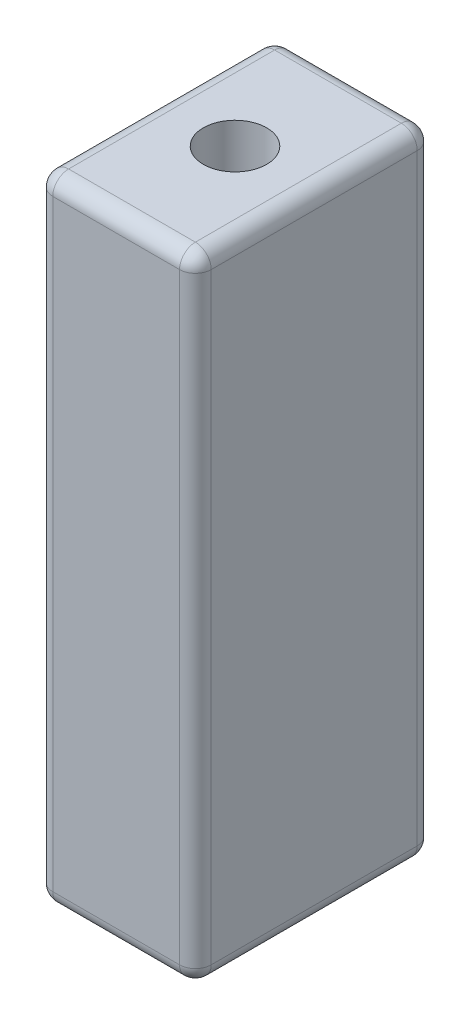
ISO-10303-21;
HEADER;
FILE_DESCRIPTION(('STEP AP214'),'2;1');
FILE_NAME('part.step','',(''),(''),'','','');
FILE_SCHEMA(('AUTOMOTIVE_DESIGN { 1 0 10303 214 1 1 1 1 }'));
ENDSEC;
DATA;
#1=APPLICATION_CONTEXT('core data for automotive mechanical design processes');
#2=APPLICATION_PROTOCOL_DEFINITION('international standard','automotive_design',2000,#1);
#3=PRODUCT_CONTEXT('',#1,'mechanical');
#4=PRODUCT('Part','Part','',(#3));
#5=PRODUCT_RELATED_PRODUCT_CATEGORY('part','',(#4));
#6=PRODUCT_DEFINITION_FORMATION('','',#4);
#7=PRODUCT_DEFINITION_CONTEXT('part definition',#1,'design');
#8=PRODUCT_DEFINITION('design','',#6,#7);
#9=PRODUCT_DEFINITION_SHAPE('','',#8);
#10=(LENGTH_UNIT() NAMED_UNIT(*) SI_UNIT(.MILLI.,.METRE.));
#11=(NAMED_UNIT(*) PLANE_ANGLE_UNIT() SI_UNIT($,.RADIAN.));
#12=(NAMED_UNIT(*) SI_UNIT($,.STERADIAN.) SOLID_ANGLE_UNIT());
#13=UNCERTAINTY_MEASURE_WITH_UNIT(LENGTH_MEASURE(1.E-05),#10,'distance_accuracy_value','');
#14=(GEOMETRIC_REPRESENTATION_CONTEXT(3) GLOBAL_UNCERTAINTY_ASSIGNED_CONTEXT((#13)) GLOBAL_UNIT_ASSIGNED_CONTEXT((#10,
#11,#12)) REPRESENTATION_CONTEXT('',''));
#15=CARTESIAN_POINT('',(0.,0.,0.));
#16=DIRECTION('',(0.,0.,1.));
#17=DIRECTION('',(1.,0.,0.));
#18=AXIS2_PLACEMENT_3D('',#15,#16,#17);
#19=CARTESIAN_POINT('',(20.,0.,30.));
#20=DIRECTION('',(0.,-1.,0.));
#21=DIRECTION('',(1.,0.,0.));
#22=AXIS2_PLACEMENT_3D('',#19,#20,#21);
#23=PLANE('',#22);
#24=CARTESIAN_POINT('',(9.99999999999999,0.,15.));
#25=DIRECTION('',(0.,-1.,0.));
#26=DIRECTION('',(1.,0.,0.));
#27=AXIS2_PLACEMENT_3D('',#24,#25,#26);
#28=CIRCLE('',#27,4.);
#29=CARTESIAN_POINT('',(14.,0.,15.));
#30=VERTEX_POINT('',#29);
#31=EDGE_CURVE('E702',#30,#30,#28,.T.);
#32=ORIENTED_EDGE('',*,*,#31,.F.);
#33=EDGE_LOOP('',(#32));
#34=FACE_BOUND('',#33,.T.);
#35=DIRECTION('',(0.,0.,-1.));
#36=VECTOR('',#35,1.);
#37=CARTESIAN_POINT('',(2.,0.,30.));
#38=LINE('',#37,#36);
#39=CARTESIAN_POINT('',(2.,0.,28.));
#40=VERTEX_POINT('',#39);
#41=CARTESIAN_POINT('',(2.,0.,2.));
#42=VERTEX_POINT('',#41);
#43=EDGE_CURVE('E189',#40,#42,#38,.T.);
#44=ORIENTED_EDGE('',*,*,#43,.T.);
#45=DIRECTION('',(-1.,0.,0.));
#46=VECTOR('',#45,1.);
#47=CARTESIAN_POINT('',(20.,0.,2.));
#48=LINE('',#47,#46);
#49=CARTESIAN_POINT('',(18.,0.,2.));
#50=VERTEX_POINT('',#49);
#51=EDGE_CURVE('E192',#42,#50,#48,.F.);
#52=ORIENTED_EDGE('',*,*,#51,.T.);
#53=DIRECTION('',(0.,0.,-1.));
#54=VECTOR('',#53,1.);
#55=CARTESIAN_POINT('',(18.,0.,30.));
#56=LINE('',#55,#54);
#57=CARTESIAN_POINT('',(18.,0.,28.));
#58=VERTEX_POINT('',#57);
#59=EDGE_CURVE('E183',#50,#58,#56,.F.);
#60=ORIENTED_EDGE('',*,*,#59,.T.);
#61=DIRECTION('',(-1.,0.,0.));
#62=VECTOR('',#61,1.);
#63=CARTESIAN_POINT('',(0.,0.,28.));
#64=LINE('',#63,#62);
#65=EDGE_CURVE('E186',#58,#40,#64,.T.);
#66=ORIENTED_EDGE('',*,*,#65,.T.);
#67=EDGE_LOOP('',(#44,#52,#60,#66));
#68=FACE_BOUND('',#67,.T.);
#69=ADVANCED_FACE('F42',(#34,#68),#23,.T.);
#70=CARTESIAN_POINT('',(20.,80.,30.));
#71=DIRECTION('',(1.,0.,0.));
#72=DIRECTION('',(0.,1.,0.));
#73=AXIS2_PLACEMENT_3D('',#70,#71,#72);
#74=PLANE('',#73);
#75=DIRECTION('',(0.,-1.,0.));
#76=VECTOR('',#75,1.);
#77=CARTESIAN_POINT('',(20.,0.,28.));
#78=LINE('',#77,#76);
#79=CARTESIAN_POINT('',(20.,78.,28.));
#80=VERTEX_POINT('',#79);
#81=CARTESIAN_POINT('',(20.,2.,28.));
#82=VERTEX_POINT('',#81);
#83=EDGE_CURVE('E209',#80,#82,#78,.T.);
#84=ORIENTED_EDGE('',*,*,#83,.T.);
#85=DIRECTION('',(0.,0.,-1.));
#86=VECTOR('',#85,1.);
#87=CARTESIAN_POINT('',(20.,2.,30.));
#88=LINE('',#87,#86);
#89=CARTESIAN_POINT('',(20.,2.,2.));
#90=VERTEX_POINT('',#89);
#91=EDGE_CURVE('E218',#82,#90,#88,.T.);
#92=ORIENTED_EDGE('',*,*,#91,.T.);
#93=DIRECTION('',(0.,-1.,0.));
#94=VECTOR('',#93,1.);
#95=CARTESIAN_POINT('',(20.,80.,2.));
#96=LINE('',#95,#94);
#97=CARTESIAN_POINT('',(20.,78.,2.));
#98=VERTEX_POINT('',#97);
#99=EDGE_CURVE('E215',#90,#98,#96,.F.);
#100=ORIENTED_EDGE('',*,*,#99,.T.);
#101=DIRECTION('',(0.,0.,-1.));
#102=VECTOR('',#101,1.);
#103=CARTESIAN_POINT('',(20.,78.,30.));
#104=LINE('',#103,#102);
#105=EDGE_CURVE('E212',#98,#80,#104,.F.);
#106=ORIENTED_EDGE('',*,*,#105,.T.);
#107=EDGE_LOOP('',(#84,#92,#100,#106));
#108=FACE_BOUND('',#107,.T.);
#109=ADVANCED_FACE('F354',(#108),#74,.T.);
#110=CARTESIAN_POINT('',(0.,80.,30.));
#111=DIRECTION('',(0.,1.,0.));
#112=DIRECTION('',(0.,0.,1.));
#113=AXIS2_PLACEMENT_3D('',#110,#111,#112);
#114=PLANE('',#113);
#115=CARTESIAN_POINT('',(10.,80.,15.));
#116=DIRECTION('',(0.,1.,0.));
#117=DIRECTION('',(0.,0.,1.));
#118=AXIS2_PLACEMENT_3D('',#115,#116,#117);
#119=CIRCLE('',#118,4.);
#120=CARTESIAN_POINT('',(10.,80.,19.));
#121=VERTEX_POINT('',#120);
#122=EDGE_CURVE('E688',#121,#121,#119,.T.);
#123=ORIENTED_EDGE('',*,*,#122,.F.);
#124=EDGE_LOOP('',(#123));
#125=FACE_BOUND('',#124,.T.);
#126=DIRECTION('',(1.,0.,0.));
#127=VECTOR('',#126,1.);
#128=CARTESIAN_POINT('',(20.,80.,28.));
#129=LINE('',#128,#127);
#130=CARTESIAN_POINT('',(2.,80.,28.));
#131=VERTEX_POINT('',#130);
#132=CARTESIAN_POINT('',(18.,80.,28.));
#133=VERTEX_POINT('',#132);
#134=EDGE_CURVE('E222',#131,#133,#129,.T.);
#135=ORIENTED_EDGE('',*,*,#134,.T.);
#136=DIRECTION('',(0.,0.,-1.));
#137=VECTOR('',#136,1.);
#138=CARTESIAN_POINT('',(18.,80.,30.));
#139=LINE('',#138,#137);
#140=CARTESIAN_POINT('',(18.,80.,2.));
#141=VERTEX_POINT('',#140);
#142=EDGE_CURVE('E11',#133,#141,#139,.T.);
#143=ORIENTED_EDGE('',*,*,#142,.T.);
#144=DIRECTION('',(1.,0.,0.));
#145=VECTOR('',#144,1.);
#146=CARTESIAN_POINT('',(0.,80.,2.));
#147=LINE('',#146,#145);
#148=CARTESIAN_POINT('',(2.,80.,2.));
#149=VERTEX_POINT('',#148);
#150=EDGE_CURVE('E52',#141,#149,#147,.F.);
#151=ORIENTED_EDGE('',*,*,#150,.T.);
#152=DIRECTION('',(0.,0.,-1.));
#153=VECTOR('',#152,1.);
#154=CARTESIAN_POINT('',(2.,80.,30.));
#155=LINE('',#154,#153);
#156=EDGE_CURVE('E225',#149,#131,#155,.F.);
#157=ORIENTED_EDGE('',*,*,#156,.T.);
#158=EDGE_LOOP('',(#135,#143,#151,#157));
#159=FACE_BOUND('',#158,.T.);
#160=ADVANCED_FACE('F383',(#125,#159),#114,.T.);
#161=CARTESIAN_POINT('',(0.,0.,30.));
#162=DIRECTION('',(-1.,0.,0.));
#163=DIRECTION('',(0.,0.,1.));
#164=AXIS2_PLACEMENT_3D('',#161,#162,#163);
#165=PLANE('',#164);
#166=DIRECTION('',(0.,0.,-1.));
#167=VECTOR('',#166,1.);
#168=CARTESIAN_POINT('',(0.,78.,30.));
#169=LINE('',#168,#167);
#170=CARTESIAN_POINT('',(0.,78.,28.));
#171=VERTEX_POINT('',#170);
#172=CARTESIAN_POINT('',(0.,78.,2.));
#173=VERTEX_POINT('',#172);
#174=EDGE_CURVE('E171',#171,#173,#169,.T.);
#175=ORIENTED_EDGE('',*,*,#174,.T.);
#176=DIRECTION('',(0.,1.,0.));
#177=VECTOR('',#176,1.);
#178=CARTESIAN_POINT('',(0.,0.,2.));
#179=LINE('',#178,#177);
#180=CARTESIAN_POINT('',(0.,2.,2.));
#181=VERTEX_POINT('',#180);
#182=EDGE_CURVE('E139',#173,#181,#179,.F.);
#183=ORIENTED_EDGE('',*,*,#182,.T.);
#184=DIRECTION('',(0.,0.,-1.));
#185=VECTOR('',#184,1.);
#186=CARTESIAN_POINT('',(0.,2.,30.));
#187=LINE('',#186,#185);
#188=CARTESIAN_POINT('',(0.,2.,28.));
#189=VERTEX_POINT('',#188);
#190=EDGE_CURVE('E178',#181,#189,#187,.F.);
#191=ORIENTED_EDGE('',*,*,#190,.T.);
#192=DIRECTION('',(0.,1.,0.));
#193=VECTOR('',#192,1.);
#194=CARTESIAN_POINT('',(0.,80.,28.));
#195=LINE('',#194,#193);
#196=EDGE_CURVE('E167',#189,#171,#195,.T.);
#197=ORIENTED_EDGE('',*,*,#196,.T.);
#198=EDGE_LOOP('',(#175,#183,#191,#197));
#199=FACE_BOUND('',#198,.T.);
#200=ADVANCED_FACE('F388',(#199),#165,.T.);
#201=CARTESIAN_POINT('',(0.,0.,30.));
#202=DIRECTION('',(0.,0.,-1.));
#203=DIRECTION('',(-1.,0.,0.));
#204=AXIS2_PLACEMENT_3D('',#201,#202,#203);
#205=PLANE('',#204);
#206=DIRECTION('',(0.,1.,0.));
#207=VECTOR('',#206,1.);
#208=CARTESIAN_POINT('',(2.,0.,30.));
#209=LINE('',#208,#207);
#210=CARTESIAN_POINT('',(2.,78.,30.));
#211=VERTEX_POINT('',#210);
#212=CARTESIAN_POINT('',(2.,2.,30.));
#213=VERTEX_POINT('',#212);
#214=EDGE_CURVE('E202',#211,#213,#209,.F.);
#215=ORIENTED_EDGE('',*,*,#214,.T.);
#216=DIRECTION('',(-1.,0.,0.));
#217=VECTOR('',#216,1.);
#218=CARTESIAN_POINT('',(20.,2.,30.));
#219=LINE('',#218,#217);
#220=CARTESIAN_POINT('',(18.,2.,30.));
#221=VERTEX_POINT('',#220);
#222=EDGE_CURVE('E205',#213,#221,#219,.F.);
#223=ORIENTED_EDGE('',*,*,#222,.T.);
#224=DIRECTION('',(0.,-1.,0.));
#225=VECTOR('',#224,1.);
#226=CARTESIAN_POINT('',(18.,80.,30.));
#227=LINE('',#226,#225);
#228=CARTESIAN_POINT('',(18.,78.,30.));
#229=VERTEX_POINT('',#228);
#230=EDGE_CURVE('E199',#221,#229,#227,.F.);
#231=ORIENTED_EDGE('',*,*,#230,.T.);
#232=DIRECTION('',(1.,0.,0.));
#233=VECTOR('',#232,1.);
#234=CARTESIAN_POINT('',(0.,78.,30.));
#235=LINE('',#234,#233);
#236=EDGE_CURVE('E196',#229,#211,#235,.F.);
#237=ORIENTED_EDGE('',*,*,#236,.T.);
#238=EDGE_LOOP('',(#215,#223,#231,#237));
#239=FACE_BOUND('',#238,.T.);
#240=ADVANCED_FACE('F320',(#239),#205,.F.);
#241=CARTESIAN_POINT('',(0.,0.,0.));
#242=DIRECTION('',(0.,0.,-1.));
#243=DIRECTION('',(-1.,0.,0.));
#244=AXIS2_PLACEMENT_3D('',#241,#242,#243);
#245=PLANE('',#244);
#246=DIRECTION('',(-1.,0.,0.));
#247=VECTOR('',#246,1.);
#248=CARTESIAN_POINT('',(0.,2.,0.));
#249=LINE('',#248,#247);
#250=CARTESIAN_POINT('',(18.,2.,0.));
#251=VERTEX_POINT('',#250);
#252=CARTESIAN_POINT('',(2.,2.,0.));
#253=VERTEX_POINT('',#252);
#254=EDGE_CURVE('E164',#251,#253,#249,.T.);
#255=ORIENTED_EDGE('',*,*,#254,.T.);
#256=DIRECTION('',(0.,1.,0.));
#257=VECTOR('',#256,1.);
#258=CARTESIAN_POINT('',(2.,0.,0.));
#259=LINE('',#258,#257);
#260=CARTESIAN_POINT('',(2.,78.,0.));
#261=VERTEX_POINT('',#260);
#262=EDGE_CURVE('E137',#253,#261,#259,.T.);
#263=ORIENTED_EDGE('',*,*,#262,.T.);
#264=DIRECTION('',(1.,0.,0.));
#265=VECTOR('',#264,1.);
#266=CARTESIAN_POINT('',(0.,78.,0.));
#267=LINE('',#266,#265);
#268=CARTESIAN_POINT('',(18.,78.,0.));
#269=VERTEX_POINT('',#268);
#270=EDGE_CURVE('E154',#261,#269,#267,.T.);
#271=ORIENTED_EDGE('',*,*,#270,.T.);
#272=DIRECTION('',(0.,-1.,0.));
#273=VECTOR('',#272,1.);
#274=CARTESIAN_POINT('',(18.,0.,0.));
#275=LINE('',#274,#273);
#276=EDGE_CURVE('E160',#269,#251,#275,.T.);
#277=ORIENTED_EDGE('',*,*,#276,.T.);
#278=EDGE_LOOP('',(#255,#263,#271,#277));
#279=FACE_BOUND('',#278,.T.);
#280=ADVANCED_FACE('F162',(#279),#245,.T.);
#281=CARTESIAN_POINT('',(18.,80.,28.));
#282=DIRECTION('',(0.,1.,0.));
#283=DIRECTION('',(-1.,0.,0.));
#284=AXIS2_PLACEMENT_3D('',#281,#282,#283);
#285=CYLINDRICAL_SURFACE('',#284,2.);
#286=CARTESIAN_POINT('',(18.,2.,28.));
#287=DIRECTION('',(0.,-1.,0.));
#288=DIRECTION('',(0.,0.,-1.));
#289=AXIS2_PLACEMENT_3D('',#286,#287,#288);
#290=CIRCLE('',#289,2.);
#291=EDGE_CURVE('E46',#82,#221,#290,.T.);
#292=ORIENTED_EDGE('',*,*,#291,.F.);
#293=ORIENTED_EDGE('',*,*,#83,.F.);
#294=CARTESIAN_POINT('',(18.,78.,28.));
#295=DIRECTION('',(0.,1.,0.));
#296=DIRECTION('',(0.,0.,1.));
#297=AXIS2_PLACEMENT_3D('',#294,#295,#296);
#298=CIRCLE('',#297,2.);
#299=EDGE_CURVE('E299',#229,#80,#298,.T.);
#300=ORIENTED_EDGE('',*,*,#299,.F.);
#301=ORIENTED_EDGE('',*,*,#230,.F.);
#302=EDGE_LOOP('',(#292,#293,#300,#301));
#303=FACE_BOUND('',#302,.T.);
#304=ADVANCED_FACE('F44',(#303),#285,.T.);
#305=CARTESIAN_POINT('',(18.,2.,28.));
#306=DIRECTION('',(0.,0.,1.));
#307=DIRECTION('',(1.,0.,0.));
#308=AXIS2_PLACEMENT_3D('',#305,#306,#307);
#309=SPHERICAL_SURFACE('',#308,2.);
#310=CARTESIAN_POINT('',(18.,2.,28.));
#311=DIRECTION('',(0.,0.,1.));
#312=DIRECTION('',(1.,0.,0.));
#313=AXIS2_PLACEMENT_3D('',#310,#311,#312);
#314=CIRCLE('',#313,2.);
#315=EDGE_CURVE('E293',#82,#58,#314,.F.);
#316=ORIENTED_EDGE('',*,*,#315,.F.);
#317=ORIENTED_EDGE('',*,*,#291,.T.);
#318=CARTESIAN_POINT('',(18.,2.,28.));
#319=DIRECTION('',(1.,0.,0.));
#320=DIRECTION('',(0.,0.,-1.));
#321=AXIS2_PLACEMENT_3D('',#318,#319,#320);
#322=CIRCLE('',#321,2.);
#323=EDGE_CURVE('E297',#58,#221,#322,.F.);
#324=ORIENTED_EDGE('',*,*,#323,.F.);
#325=EDGE_LOOP('',(#316,#317,#324));
#326=FACE_BOUND('',#325,.T.);
#327=ADVANCED_FACE('F313',(#326),#309,.T.);
#328=CARTESIAN_POINT('',(18.,78.,28.));
#329=DIRECTION('',(1.,0.,0.));
#330=DIRECTION('',(0.,0.,-1.));
#331=AXIS2_PLACEMENT_3D('',#328,#329,#330);
#332=SPHERICAL_SURFACE('',#331,2.);
#333=CARTESIAN_POINT('',(18.,78.,28.));
#334=DIRECTION('',(1.,0.,0.));
#335=DIRECTION('',(0.,0.,-1.));
#336=AXIS2_PLACEMENT_3D('',#333,#334,#335);
#337=CIRCLE('',#336,2.);
#338=EDGE_CURVE('E285',#229,#133,#337,.F.);
#339=ORIENTED_EDGE('',*,*,#338,.F.);
#340=ORIENTED_EDGE('',*,*,#299,.T.);
#341=CARTESIAN_POINT('',(18.,78.,28.));
#342=DIRECTION('',(0.,0.,1.));
#343=DIRECTION('',(1.,0.,0.));
#344=AXIS2_PLACEMENT_3D('',#341,#342,#343);
#345=CIRCLE('',#344,2.);
#346=EDGE_CURVE('E289',#133,#80,#345,.F.);
#347=ORIENTED_EDGE('',*,*,#346,.F.);
#348=EDGE_LOOP('',(#339,#340,#347));
#349=FACE_BOUND('',#348,.T.);
#350=ADVANCED_FACE('F594',(#349),#332,.T.);
#351=CARTESIAN_POINT('',(20.,2.,28.));
#352=DIRECTION('',(1.,0.,0.));
#353=DIRECTION('',(0.,1.,0.));
#354=AXIS2_PLACEMENT_3D('',#351,#352,#353);
#355=CYLINDRICAL_SURFACE('',#354,2.);
#356=ORIENTED_EDGE('',*,*,#323,.T.);
#357=ORIENTED_EDGE('',*,*,#222,.F.);
#358=CARTESIAN_POINT('',(2.,2.,28.));
#359=DIRECTION('',(-1.,0.,0.));
#360=DIRECTION('',(0.,0.,1.));
#361=AXIS2_PLACEMENT_3D('',#358,#359,#360);
#362=CIRCLE('',#361,2.);
#363=EDGE_CURVE('E277',#40,#213,#362,.T.);
#364=ORIENTED_EDGE('',*,*,#363,.F.);
#365=ORIENTED_EDGE('',*,*,#65,.F.);
#366=EDGE_LOOP('',(#356,#357,#364,#365));
#367=FACE_BOUND('',#366,.T.);
#368=ADVANCED_FACE('F325',(#367),#355,.T.);
#369=CARTESIAN_POINT('',(18.,2.,30.));
#370=DIRECTION('',(0.,0.,-1.));
#371=DIRECTION('',(-1.,0.,0.));
#372=AXIS2_PLACEMENT_3D('',#369,#370,#371);
#373=CYLINDRICAL_SURFACE('',#372,2.);
#374=ORIENTED_EDGE('',*,*,#315,.T.);
#375=ORIENTED_EDGE('',*,*,#59,.F.);
#376=CARTESIAN_POINT('',(18.,2.,2.));
#377=DIRECTION('',(0.,0.,-1.));
#378=DIRECTION('',(-1.,0.,0.));
#379=AXIS2_PLACEMENT_3D('',#376,#377,#378);
#380=CIRCLE('',#379,2.);
#381=EDGE_CURVE('E273',#90,#50,#380,.T.);
#382=ORIENTED_EDGE('',*,*,#381,.F.);
#383=ORIENTED_EDGE('',*,*,#91,.F.);
#384=EDGE_LOOP('',(#374,#375,#382,#383));
#385=FACE_BOUND('',#384,.T.);
#386=ADVANCED_FACE('F352',(#385),#373,.T.);
#387=CARTESIAN_POINT('',(18.,0.,2.));
#388=DIRECTION('',(0.,-1.,0.));
#389=DIRECTION('',(1.,0.,0.));
#390=AXIS2_PLACEMENT_3D('',#387,#388,#389);
#391=CYLINDRICAL_SURFACE('',#390,2.);
#392=CARTESIAN_POINT('',(18.,78.,2.));
#393=DIRECTION('',(0.,1.,0.));
#394=DIRECTION('',(0.,0.,1.));
#395=AXIS2_PLACEMENT_3D('',#392,#393,#394);
#396=CIRCLE('',#395,2.);
#397=EDGE_CURVE('E266',#98,#269,#396,.T.);
#398=ORIENTED_EDGE('',*,*,#397,.F.);
#399=ORIENTED_EDGE('',*,*,#99,.F.);
#400=CARTESIAN_POINT('',(18.,2.,2.));
#401=DIRECTION('',(0.,-1.,0.));
#402=DIRECTION('',(1.,0.,0.));
#403=AXIS2_PLACEMENT_3D('',#400,#401,#402);
#404=CIRCLE('',#403,2.);
#405=EDGE_CURVE('E270',#251,#90,#404,.T.);
#406=ORIENTED_EDGE('',*,*,#405,.F.);
#407=ORIENTED_EDGE('',*,*,#276,.F.);
#408=EDGE_LOOP('',(#398,#399,#406,#407));
#409=FACE_BOUND('',#408,.T.);
#410=ADVANCED_FACE('F362',(#409),#391,.T.);
#411=CARTESIAN_POINT('',(18.,78.,30.));
#412=DIRECTION('',(0.,0.,-1.));
#413=DIRECTION('',(-1.,0.,0.));
#414=AXIS2_PLACEMENT_3D('',#411,#412,#413);
#415=CYLINDRICAL_SURFACE('',#414,2.);
#416=ORIENTED_EDGE('',*,*,#346,.T.);
#417=ORIENTED_EDGE('',*,*,#105,.F.);
#418=CARTESIAN_POINT('',(18.,78.,2.));
#419=DIRECTION('',(0.,0.,-1.));
#420=DIRECTION('',(-1.,0.,0.));
#421=AXIS2_PLACEMENT_3D('',#418,#419,#420);
#422=CIRCLE('',#421,2.);
#423=EDGE_CURVE('E262',#141,#98,#422,.T.);
#424=ORIENTED_EDGE('',*,*,#423,.F.);
#425=ORIENTED_EDGE('',*,*,#142,.F.);
#426=EDGE_LOOP('',(#416,#417,#424,#425));
#427=FACE_BOUND('',#426,.T.);
#428=ADVANCED_FACE('F359',(#427),#415,.T.);
#429=CARTESIAN_POINT('',(0.,78.,28.));
#430=DIRECTION('',(-1.,0.,0.));
#431=DIRECTION('',(0.,0.,1.));
#432=AXIS2_PLACEMENT_3D('',#429,#430,#431);
#433=CYLINDRICAL_SURFACE('',#432,2.);
#434=ORIENTED_EDGE('',*,*,#338,.T.);
#435=ORIENTED_EDGE('',*,*,#134,.F.);
#436=CARTESIAN_POINT('',(2.,78.,28.));
#437=DIRECTION('',(-1.,0.,0.));
#438=DIRECTION('',(0.,0.,1.));
#439=AXIS2_PLACEMENT_3D('',#436,#437,#438);
#440=CIRCLE('',#439,2.);
#441=EDGE_CURVE('E258',#211,#131,#440,.T.);
#442=ORIENTED_EDGE('',*,*,#441,.F.);
#443=ORIENTED_EDGE('',*,*,#236,.F.);
#444=EDGE_LOOP('',(#434,#435,#442,#443));
#445=FACE_BOUND('',#444,.T.);
#446=ADVANCED_FACE('F547',(#445),#433,.T.);
#447=CARTESIAN_POINT('',(2.,0.,28.));
#448=DIRECTION('',(0.,-1.,0.));
#449=DIRECTION('',(0.,0.,-1.));
#450=AXIS2_PLACEMENT_3D('',#447,#448,#449);
#451=CYLINDRICAL_SURFACE('',#450,2.);
#452=CARTESIAN_POINT('',(2.,2.,28.));
#453=DIRECTION('',(0.,-1.,0.));
#454=DIRECTION('',(0.,0.,-1.));
#455=AXIS2_PLACEMENT_3D('',#452,#453,#454);
#456=CIRCLE('',#455,2.);
#457=EDGE_CURVE('E281',#213,#189,#456,.T.);
#458=ORIENTED_EDGE('',*,*,#457,.F.);
#459=ORIENTED_EDGE('',*,*,#214,.F.);
#460=CARTESIAN_POINT('',(2.,78.,28.));
#461=DIRECTION('',(0.,1.,0.));
#462=DIRECTION('',(0.,0.,1.));
#463=AXIS2_PLACEMENT_3D('',#460,#461,#462);
#464=CIRCLE('',#463,2.);
#465=EDGE_CURVE('E254',#171,#211,#464,.T.);
#466=ORIENTED_EDGE('',*,*,#465,.F.);
#467=ORIENTED_EDGE('',*,*,#196,.F.);
#468=EDGE_LOOP('',(#458,#459,#466,#467));
#469=FACE_BOUND('',#468,.T.);
#470=ADVANCED_FACE('F329',(#469),#451,.T.);
#471=CARTESIAN_POINT('',(2.,2.,28.));
#472=DIRECTION('',(0.,0.,1.));
#473=DIRECTION('',(1.,0.,0.));
#474=AXIS2_PLACEMENT_3D('',#471,#472,#473);
#475=SPHERICAL_SURFACE('',#474,2.);
#476=ORIENTED_EDGE('',*,*,#363,.T.);
#477=ORIENTED_EDGE('',*,*,#457,.T.);
#478=CARTESIAN_POINT('',(2.,2.,28.));
#479=DIRECTION('',(0.,0.,1.));
#480=DIRECTION('',(1.,0.,0.));
#481=AXIS2_PLACEMENT_3D('',#478,#479,#480);
#482=CIRCLE('',#481,2.);
#483=EDGE_CURVE('E250',#40,#189,#482,.F.);
#484=ORIENTED_EDGE('',*,*,#483,.F.);
#485=EDGE_LOOP('',(#476,#477,#484));
#486=FACE_BOUND('',#485,.T.);
#487=ADVANCED_FACE('F333',(#486),#475,.T.);
#488=CARTESIAN_POINT('',(18.,2.,2.));
#489=DIRECTION('',(1.,0.,0.));
#490=DIRECTION('',(0.,1.,0.));
#491=AXIS2_PLACEMENT_3D('',#488,#489,#490);
#492=SPHERICAL_SURFACE('',#491,2.);
#493=ORIENTED_EDGE('',*,*,#405,.T.);
#494=ORIENTED_EDGE('',*,*,#381,.T.);
#495=CARTESIAN_POINT('',(18.,2.,2.));
#496=DIRECTION('',(1.,0.,0.));
#497=DIRECTION('',(0.,0.,-1.));
#498=AXIS2_PLACEMENT_3D('',#495,#496,#497);
#499=CIRCLE('',#498,2.);
#500=EDGE_CURVE('E247',#251,#50,#499,.F.);
#501=ORIENTED_EDGE('',*,*,#500,.F.);
#502=EDGE_LOOP('',(#493,#494,#501));
#503=FACE_BOUND('',#502,.T.);
#504=ADVANCED_FACE('F348',(#503),#492,.T.);
#505=CARTESIAN_POINT('',(18.,78.,2.));
#506=DIRECTION('',(1.,0.,0.));
#507=DIRECTION('',(0.,0.,-1.));
#508=AXIS2_PLACEMENT_3D('',#505,#506,#507);
#509=SPHERICAL_SURFACE('',#508,2.);
#510=ORIENTED_EDGE('',*,*,#423,.T.);
#511=ORIENTED_EDGE('',*,*,#397,.T.);
#512=CARTESIAN_POINT('',(18.,78.,2.));
#513=DIRECTION('',(1.,0.,0.));
#514=DIRECTION('',(0.,0.,-1.));
#515=AXIS2_PLACEMENT_3D('',#512,#513,#514);
#516=CIRCLE('',#515,2.);
#517=EDGE_CURVE('E156',#141,#269,#516,.F.);
#518=ORIENTED_EDGE('',*,*,#517,.F.);
#519=EDGE_LOOP('',(#510,#511,#518));
#520=FACE_BOUND('',#519,.T.);
#521=ADVANCED_FACE('F364',(#520),#509,.T.);
#522=CARTESIAN_POINT('',(2.,78.,28.));
#523=DIRECTION('',(0.,0.,1.));
#524=DIRECTION('',(1.,0.,0.));
#525=AXIS2_PLACEMENT_3D('',#522,#523,#524);
#526=SPHERICAL_SURFACE('',#525,2.);
#527=ORIENTED_EDGE('',*,*,#465,.T.);
#528=ORIENTED_EDGE('',*,*,#441,.T.);
#529=CARTESIAN_POINT('',(2.,78.,28.));
#530=DIRECTION('',(0.,0.,1.));
#531=DIRECTION('',(1.,0.,0.));
#532=AXIS2_PLACEMENT_3D('',#529,#530,#531);
#533=CIRCLE('',#532,2.);
#534=EDGE_CURVE('E241',#171,#131,#533,.F.);
#535=ORIENTED_EDGE('',*,*,#534,.F.);
#536=EDGE_LOOP('',(#527,#528,#535));
#537=FACE_BOUND('',#536,.T.);
#538=ADVANCED_FACE('F366',(#537),#526,.T.);
#539=CARTESIAN_POINT('',(2.,2.,30.));
#540=DIRECTION('',(0.,0.,-1.));
#541=DIRECTION('',(-1.,0.,0.));
#542=AXIS2_PLACEMENT_3D('',#539,#540,#541);
#543=CYLINDRICAL_SURFACE('',#542,2.);
#544=ORIENTED_EDGE('',*,*,#483,.T.);
#545=ORIENTED_EDGE('',*,*,#190,.F.);
#546=CARTESIAN_POINT('',(2.,2.,2.));
#547=DIRECTION('',(0.,0.,-1.));
#548=DIRECTION('',(-1.,0.,0.));
#549=AXIS2_PLACEMENT_3D('',#546,#547,#548);
#550=CIRCLE('',#549,2.);
#551=EDGE_CURVE('E237',#42,#181,#550,.T.);
#552=ORIENTED_EDGE('',*,*,#551,.F.);
#553=ORIENTED_EDGE('',*,*,#43,.F.);
#554=EDGE_LOOP('',(#544,#545,#552,#553));
#555=FACE_BOUND('',#554,.T.);
#556=ADVANCED_FACE('F338',(#555),#543,.T.);
#557=CARTESIAN_POINT('',(0.,2.,2.));
#558=DIRECTION('',(-1.,0.,0.));
#559=DIRECTION('',(0.,-1.,0.));
#560=AXIS2_PLACEMENT_3D('',#557,#558,#559);
#561=CYLINDRICAL_SURFACE('',#560,2.);
#562=ORIENTED_EDGE('',*,*,#500,.T.);
#563=ORIENTED_EDGE('',*,*,#51,.F.);
#564=CARTESIAN_POINT('',(2.,2.,2.));
#565=DIRECTION('',(-1.,0.,0.));
#566=DIRECTION('',(0.,-1.,0.));
#567=AXIS2_PLACEMENT_3D('',#564,#565,#566);
#568=CIRCLE('',#567,2.);
#569=EDGE_CURVE('E152',#253,#42,#568,.T.);
#570=ORIENTED_EDGE('',*,*,#569,.F.);
#571=ORIENTED_EDGE('',*,*,#254,.F.);
#572=EDGE_LOOP('',(#562,#563,#570,#571));
#573=FACE_BOUND('',#572,.T.);
#574=ADVANCED_FACE('F342',(#573),#561,.T.);
#575=CARTESIAN_POINT('',(0.,78.,2.));
#576=DIRECTION('',(1.,0.,0.));
#577=DIRECTION('',(0.,0.,-1.));
#578=AXIS2_PLACEMENT_3D('',#575,#576,#577);
#579=CYLINDRICAL_SURFACE('',#578,2.);
#580=ORIENTED_EDGE('',*,*,#517,.T.);
#581=ORIENTED_EDGE('',*,*,#270,.F.);
#582=CARTESIAN_POINT('',(2.,78.,2.));
#583=DIRECTION('',(-1.,0.,0.));
#584=DIRECTION('',(0.,0.,1.));
#585=AXIS2_PLACEMENT_3D('',#582,#583,#584);
#586=CIRCLE('',#585,2.);
#587=EDGE_CURVE('E146',#149,#261,#586,.T.);
#588=ORIENTED_EDGE('',*,*,#587,.F.);
#589=ORIENTED_EDGE('',*,*,#150,.F.);
#590=EDGE_LOOP('',(#580,#581,#588,#589));
#591=FACE_BOUND('',#590,.T.);
#592=ADVANCED_FACE('F155',(#591),#579,.T.);
#593=CARTESIAN_POINT('',(2.,78.,30.));
#594=DIRECTION('',(0.,0.,-1.));
#595=DIRECTION('',(-1.,0.,0.));
#596=AXIS2_PLACEMENT_3D('',#593,#594,#595);
#597=CYLINDRICAL_SURFACE('',#596,2.);
#598=ORIENTED_EDGE('',*,*,#534,.T.);
#599=ORIENTED_EDGE('',*,*,#156,.F.);
#600=CARTESIAN_POINT('',(2.,78.,2.));
#601=DIRECTION('',(0.,0.,-1.));
#602=DIRECTION('',(-1.,0.,0.));
#603=AXIS2_PLACEMENT_3D('',#600,#601,#602);
#604=CIRCLE('',#603,2.);
#605=EDGE_CURVE('E150',#173,#149,#604,.T.);
#606=ORIENTED_EDGE('',*,*,#605,.F.);
#607=ORIENTED_EDGE('',*,*,#174,.F.);
#608=EDGE_LOOP('',(#598,#599,#606,#607));
#609=FACE_BOUND('',#608,.T.);
#610=ADVANCED_FACE('F398',(#609),#597,.T.);
#611=CARTESIAN_POINT('',(2.,2.,2.));
#612=DIRECTION('',(0.,-1.,0.));
#613=DIRECTION('',(1.,0.,0.));
#614=AXIS2_PLACEMENT_3D('',#611,#612,#613);
#615=SPHERICAL_SURFACE('',#614,2.);
#616=ORIENTED_EDGE('',*,*,#569,.T.);
#617=ORIENTED_EDGE('',*,*,#551,.T.);
#618=CARTESIAN_POINT('',(2.,2.,2.));
#619=DIRECTION('',(0.,-1.,0.));
#620=DIRECTION('',(0.,0.,-1.));
#621=AXIS2_PLACEMENT_3D('',#618,#619,#620);
#622=CIRCLE('',#621,2.);
#623=EDGE_CURVE('E143',#253,#181,#622,.F.);
#624=ORIENTED_EDGE('',*,*,#623,.F.);
#625=EDGE_LOOP('',(#616,#617,#624));
#626=FACE_BOUND('',#625,.T.);
#627=ADVANCED_FACE('F395',(#626),#615,.T.);
#628=CARTESIAN_POINT('',(2.,78.,2.));
#629=DIRECTION('',(0.,1.,0.));
#630=DIRECTION('',(0.,0.,1.));
#631=AXIS2_PLACEMENT_3D('',#628,#629,#630);
#632=SPHERICAL_SURFACE('',#631,2.);
#633=ORIENTED_EDGE('',*,*,#605,.T.);
#634=ORIENTED_EDGE('',*,*,#587,.T.);
#635=CARTESIAN_POINT('',(2.,78.,2.));
#636=DIRECTION('',(0.,1.,0.));
#637=DIRECTION('',(0.,0.,1.));
#638=AXIS2_PLACEMENT_3D('',#635,#636,#637);
#639=CIRCLE('',#638,2.);
#640=EDGE_CURVE('E133',#173,#261,#639,.F.);
#641=ORIENTED_EDGE('',*,*,#640,.F.);
#642=EDGE_LOOP('',(#633,#634,#641));
#643=FACE_BOUND('',#642,.T.);
#644=ADVANCED_FACE('F148',(#643),#632,.T.);
#645=CARTESIAN_POINT('',(2.,0.,2.));
#646=DIRECTION('',(0.,1.,0.));
#647=DIRECTION('',(0.,0.,1.));
#648=AXIS2_PLACEMENT_3D('',#645,#646,#647);
#649=CYLINDRICAL_SURFACE('',#648,2.);
#650=ORIENTED_EDGE('',*,*,#623,.T.);
#651=ORIENTED_EDGE('',*,*,#182,.F.);
#652=ORIENTED_EDGE('',*,*,#640,.T.);
#653=ORIENTED_EDGE('',*,*,#262,.F.);
#654=EDGE_LOOP('',(#650,#651,#652,#653));
#655=FACE_BOUND('',#654,.T.);
#656=ADVANCED_FACE('F135',(#655),#649,.T.);
#657=CARTESIAN_POINT('',(10.,70.,15.));
#658=DIRECTION('',(0.,1.,0.));
#659=DIRECTION('',(0.,0.,1.));
#660=AXIS2_PLACEMENT_3D('',#657,#658,#659);
#661=CYLINDRICAL_SURFACE('',#660,4.);
#662=CARTESIAN_POINT('',(10.,70.,15.));
#663=DIRECTION('',(0.,1.,0.));
#664=DIRECTION('',(0.,0.,1.));
#665=AXIS2_PLACEMENT_3D('',#662,#663,#664);
#666=CIRCLE('',#665,4.);
#667=CARTESIAN_POINT('',(10.,70.,19.));
#668=VERTEX_POINT('',#667);
#669=EDGE_CURVE('E144',#668,#668,#666,.T.);
#670=ORIENTED_EDGE('',*,*,#669,.F.);
#671=EDGE_LOOP('',(#670));
#672=FACE_BOUND('',#671,.T.);
#673=ORIENTED_EDGE('',*,*,#122,.T.);
#674=EDGE_LOOP('',(#673));
#675=FACE_BOUND('',#674,.T.);
#676=ADVANCED_FACE('F392',(#672,#675),#661,.F.);
#677=CARTESIAN_POINT('',(10.,70.,15.));
#678=DIRECTION('',(0.,1.,0.));
#679=DIRECTION('',(0.,0.,1.));
#680=AXIS2_PLACEMENT_3D('',#677,#678,#679);
#681=PLANE('',#680);
#682=ORIENTED_EDGE('',*,*,#669,.T.);
#683=EDGE_LOOP('',(#682));
#684=FACE_BOUND('',#683,.T.);
#685=ADVANCED_FACE('F443',(#684),#681,.T.);
#686=CARTESIAN_POINT('',(9.99999999999999,10.,15.));
#687=DIRECTION('',(0.,-1.,0.));
#688=DIRECTION('',(1.,0.,0.));
#689=AXIS2_PLACEMENT_3D('',#686,#687,#688);
#690=CYLINDRICAL_SURFACE('',#689,4.);
#691=CARTESIAN_POINT('',(9.99999999999999,10.,15.));
#692=DIRECTION('',(0.,-1.,0.));
#693=DIRECTION('',(1.,0.,0.));
#694=AXIS2_PLACEMENT_3D('',#691,#692,#693);
#695=CIRCLE('',#694,4.);
#696=CARTESIAN_POINT('',(14.,10.,15.));
#697=VERTEX_POINT('',#696);
#698=EDGE_CURVE('E695',#697,#697,#695,.T.);
#699=ORIENTED_EDGE('',*,*,#698,.F.);
#700=EDGE_LOOP('',(#699));
#701=FACE_BOUND('',#700,.T.);
#702=ORIENTED_EDGE('',*,*,#31,.T.);
#703=EDGE_LOOP('',(#702));
#704=FACE_BOUND('',#703,.T.);
#705=ADVANCED_FACE('F450',(#701,#704),#690,.F.);
#706=CARTESIAN_POINT('',(9.99999999999999,10.,15.));
#707=DIRECTION('',(0.,-1.,0.));
#708=DIRECTION('',(1.,0.,0.));
#709=AXIS2_PLACEMENT_3D('',#706,#707,#708);
#710=PLANE('',#709);
#711=ORIENTED_EDGE('',*,*,#698,.T.);
#712=EDGE_LOOP('',(#711));
#713=FACE_BOUND('',#712,.T.);
#714=ADVANCED_FACE('F457',(#713),#710,.T.);
#715=CLOSED_SHELL('',(#69,#109,#160,#200,#240,#280,#304,#327,#350,#368,#386,#410,#428,#446,#470,
#487,#504,#521,#538,#556,#574,#592,#610,#627,#644,#656,#676,#685,#705,#714));
#716=MANIFOLD_SOLID_BREP('B2',#715);
#717=ADVANCED_BREP_SHAPE_REPRESENTATION('',(#18,#716),#14);
#718=SHAPE_DEFINITION_REPRESENTATION(#9,#717);
ENDSEC;
END-ISO-10303-21;
